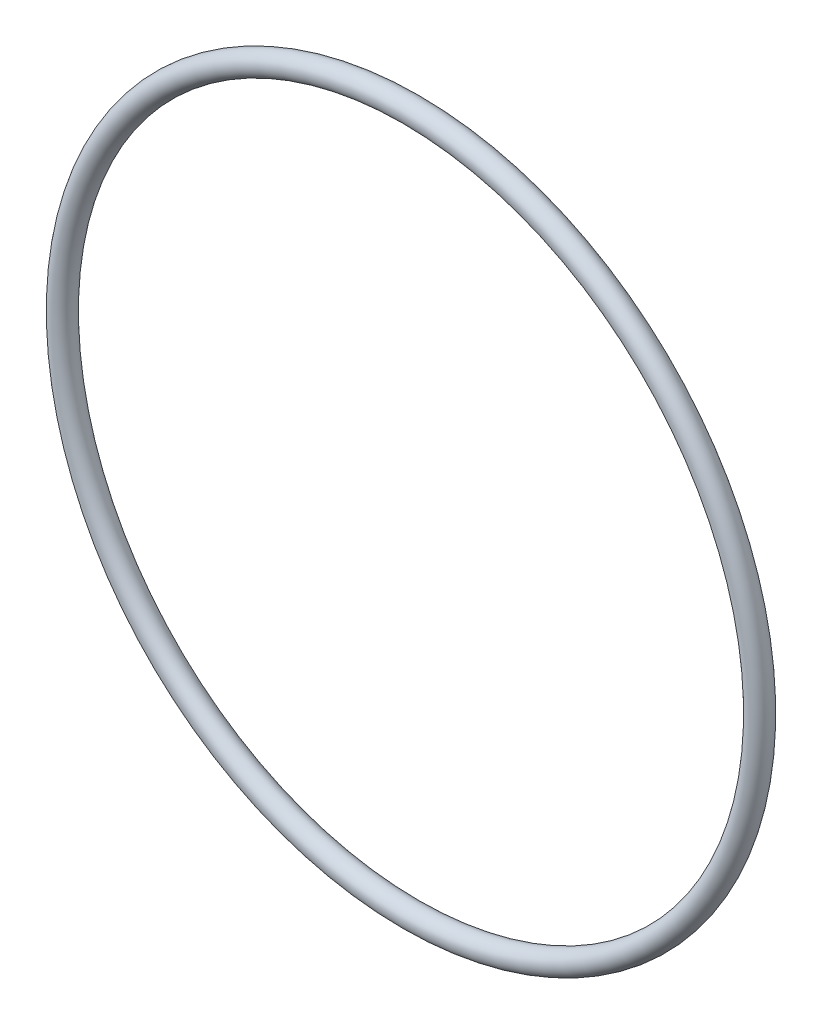
ISO-10303-21;
HEADER;
FILE_DESCRIPTION(('STEP AP214'),'2;1');
FILE_NAME('part.step','',(''),(''),'','','');
FILE_SCHEMA(('AUTOMOTIVE_DESIGN { 1 0 10303 214 1 1 1 1 }'));
ENDSEC;
DATA;
#1=APPLICATION_CONTEXT('core data for automotive mechanical design processes');
#2=APPLICATION_PROTOCOL_DEFINITION('international standard','automotive_design',2000,#1);
#3=PRODUCT_CONTEXT('',#1,'mechanical');
#4=PRODUCT('Part','Part','',(#3));
#5=PRODUCT_RELATED_PRODUCT_CATEGORY('part','',(#4));
#6=PRODUCT_DEFINITION_FORMATION('','',#4);
#7=PRODUCT_DEFINITION_CONTEXT('part definition',#1,'design');
#8=PRODUCT_DEFINITION('design','',#6,#7);
#9=PRODUCT_DEFINITION_SHAPE('','',#8);
#10=(LENGTH_UNIT() NAMED_UNIT(*) SI_UNIT(.MILLI.,.METRE.));
#11=(NAMED_UNIT(*) PLANE_ANGLE_UNIT() SI_UNIT($,.RADIAN.));
#12=(NAMED_UNIT(*) SI_UNIT($,.STERADIAN.) SOLID_ANGLE_UNIT());
#13=UNCERTAINTY_MEASURE_WITH_UNIT(LENGTH_MEASURE(1.E-05),#10,'distance_accuracy_value','');
#14=(GEOMETRIC_REPRESENTATION_CONTEXT(3) GLOBAL_UNCERTAINTY_ASSIGNED_CONTEXT((#13)) GLOBAL_UNIT_ASSIGNED_CONTEXT((#10,
#11,#12)) REPRESENTATION_CONTEXT('',''));
#15=CARTESIAN_POINT('',(0.,0.,0.));
#16=DIRECTION('',(0.,0.,1.));
#17=DIRECTION('',(1.,0.,0.));
#18=AXIS2_PLACEMENT_3D('',#15,#16,#17);
#19=CARTESIAN_POINT('',(0.,0.,0.));
#20=DIRECTION('',(0.,0.,-1.));
#21=DIRECTION('',(0.,1.,0.));
#22=AXIS2_PLACEMENT_3D('',#19,#20,#21);
#23=TOROIDAL_SURFACE('',#22,23.,0.75);
#24=CARTESIAN_POINT('',(0.,23.75,0.));
#25=VERTEX_POINT('',#24);
#26=VERTEX_LOOP('',#25);
#27=FACE_BOUND('',#26,.T.);
#28=ADVANCED_FACE('F38',(#27),#23,.T.);
#29=CLOSED_SHELL('',(#28));
#30=MANIFOLD_SOLID_BREP('B2',#29);
#31=ADVANCED_BREP_SHAPE_REPRESENTATION('',(#18,#30),#14);
#32=SHAPE_DEFINITION_REPRESENTATION(#9,#31);
ENDSEC;
END-ISO-10303-21;
